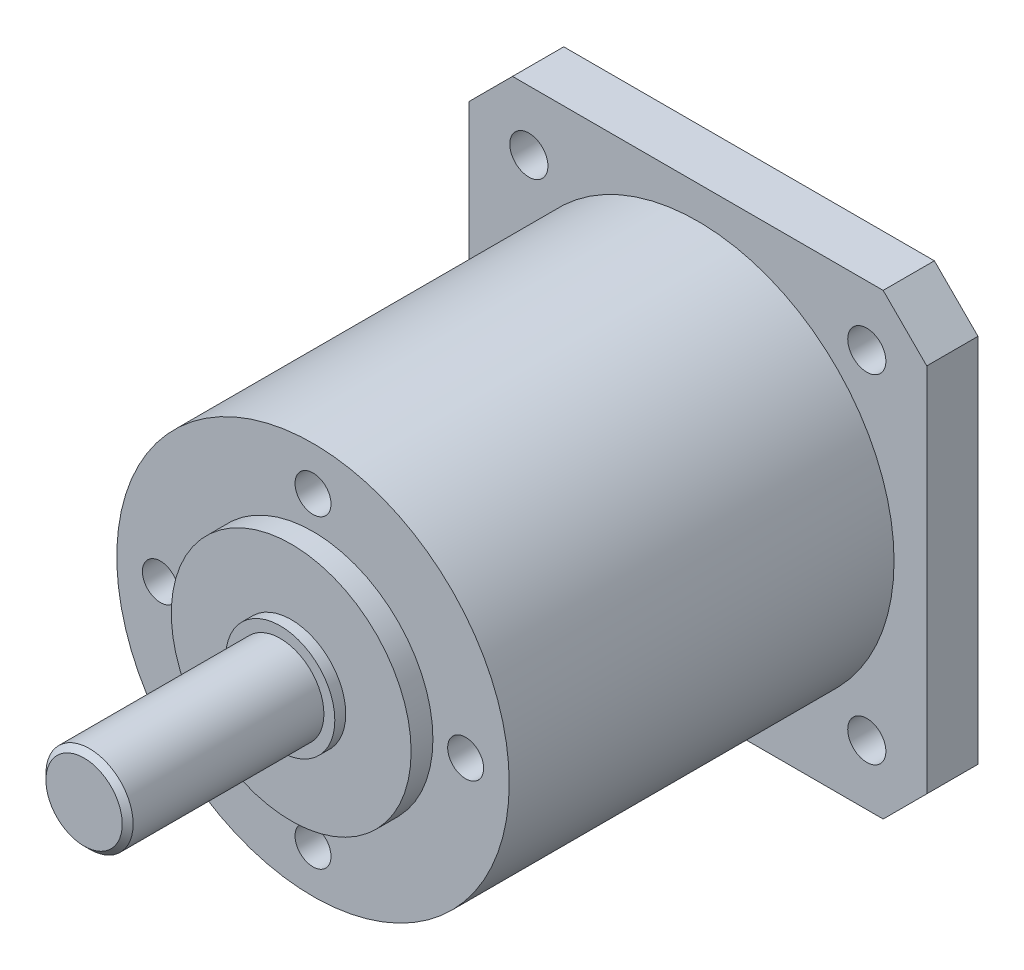
ISO-10303-21;
HEADER;
FILE_DESCRIPTION(('STEP AP214'),'2;1');
FILE_NAME('part.step','',(''),(''),'','','');
FILE_SCHEMA(('AUTOMOTIVE_DESIGN { 1 0 10303 214 1 1 1 1 }'));
ENDSEC;
DATA;
#1=APPLICATION_CONTEXT('core data for automotive mechanical design processes');
#2=APPLICATION_PROTOCOL_DEFINITION('international standard','automotive_design',2000,#1);
#3=PRODUCT_CONTEXT('',#1,'mechanical');
#4=PRODUCT('Part','Part','',(#3));
#5=PRODUCT_RELATED_PRODUCT_CATEGORY('part','',(#4));
#6=PRODUCT_DEFINITION_FORMATION('','',#4);
#7=PRODUCT_DEFINITION_CONTEXT('part definition',#1,'design');
#8=PRODUCT_DEFINITION('design','',#6,#7);
#9=PRODUCT_DEFINITION_SHAPE('','',#8);
#10=(LENGTH_UNIT() NAMED_UNIT(*) SI_UNIT(.MILLI.,.METRE.));
#11=(NAMED_UNIT(*) PLANE_ANGLE_UNIT() SI_UNIT($,.RADIAN.));
#12=(NAMED_UNIT(*) SI_UNIT($,.STERADIAN.) SOLID_ANGLE_UNIT());
#13=UNCERTAINTY_MEASURE_WITH_UNIT(LENGTH_MEASURE(1.E-05),#10,'distance_accuracy_value','');
#14=(GEOMETRIC_REPRESENTATION_CONTEXT(3) GLOBAL_UNCERTAINTY_ASSIGNED_CONTEXT((#13)) GLOBAL_UNIT_ASSIGNED_CONTEXT((#10,
#11,#12)) REPRESENTATION_CONTEXT('',''));
#15=CARTESIAN_POINT('',(0.,0.,0.));
#16=DIRECTION('',(0.,0.,1.));
#17=DIRECTION('',(1.,0.,0.));
#18=AXIS2_PLACEMENT_3D('',#15,#16,#17);
#19=CARTESIAN_POINT('',(-17.,21.,4.7));
#20=DIRECTION('',(0.,-1.,0.));
#21=DIRECTION('',(0.,0.,-1.));
#22=AXIS2_PLACEMENT_3D('',#19,#20,#21);
#23=PLANE('',#22);
#24=DIRECTION('',(-1.,0.,0.));
#25=VECTOR('',#24,1.);
#26=CARTESIAN_POINT('',(-17.,21.,0.));
#27=LINE('',#26,#25);
#28=CARTESIAN_POINT('',(17.,21.,0.));
#29=VERTEX_POINT('',#28);
#30=CARTESIAN_POINT('',(-17.,21.,0.));
#31=VERTEX_POINT('',#30);
#32=EDGE_CURVE('E143',#29,#31,#27,.T.);
#33=ORIENTED_EDGE('',*,*,#32,.T.);
#34=DIRECTION('',(0.,0.,-1.));
#35=VECTOR('',#34,1.);
#36=CARTESIAN_POINT('',(-17.,21.,4.7));
#37=LINE('',#36,#35);
#38=CARTESIAN_POINT('',(-17.,21.,4.7));
#39=VERTEX_POINT('',#38);
#40=EDGE_CURVE('E171',#39,#31,#37,.T.);
#41=ORIENTED_EDGE('',*,*,#40,.F.);
#42=DIRECTION('',(-1.,0.,0.));
#43=VECTOR('',#42,1.);
#44=CARTESIAN_POINT('',(-17.,21.,4.7));
#45=LINE('',#44,#43);
#46=CARTESIAN_POINT('',(17.,21.,4.7));
#47=VERTEX_POINT('',#46);
#48=EDGE_CURVE('E158',#47,#39,#45,.T.);
#49=ORIENTED_EDGE('',*,*,#48,.F.);
#50=DIRECTION('',(0.,0.,-1.));
#51=VECTOR('',#50,1.);
#52=CARTESIAN_POINT('',(17.,21.,4.7));
#53=LINE('',#52,#51);
#54=EDGE_CURVE('E139',#47,#29,#53,.T.);
#55=ORIENTED_EDGE('',*,*,#54,.T.);
#56=EDGE_LOOP('',(#33,#41,#49,#55));
#57=FACE_BOUND('',#56,.T.);
#58=ADVANCED_FACE('F41',(#57),#23,.F.);
#59=CARTESIAN_POINT('',(-21.,17.,4.7));
#60=DIRECTION('',(0.707106781186548,-0.707106781186548,0.));
#61=DIRECTION('',(0.707106781186548,0.707106781186548,0.));
#62=AXIS2_PLACEMENT_3D('',#59,#60,#61);
#63=PLANE('',#62);
#64=DIRECTION('',(-0.707106781186548,-0.707106781186548,0.));
#65=VECTOR('',#64,1.);
#66=CARTESIAN_POINT('',(-21.,17.,0.));
#67=LINE('',#66,#65);
#68=CARTESIAN_POINT('',(-21.,17.,0.));
#69=VERTEX_POINT('',#68);
#70=EDGE_CURVE('E146',#31,#69,#67,.T.);
#71=ORIENTED_EDGE('',*,*,#70,.T.);
#72=DIRECTION('',(0.,0.,-1.));
#73=VECTOR('',#72,1.);
#74=CARTESIAN_POINT('',(-21.,17.,4.7));
#75=LINE('',#74,#73);
#76=CARTESIAN_POINT('',(-21.,17.,4.7));
#77=VERTEX_POINT('',#76);
#78=EDGE_CURVE('E168',#77,#69,#75,.T.);
#79=ORIENTED_EDGE('',*,*,#78,.F.);
#80=DIRECTION('',(-0.707106781186548,-0.707106781186548,0.));
#81=VECTOR('',#80,1.);
#82=CARTESIAN_POINT('',(-21.,17.,4.7));
#83=LINE('',#82,#81);
#84=EDGE_CURVE('E104',#39,#77,#83,.T.);
#85=ORIENTED_EDGE('',*,*,#84,.F.);
#86=ORIENTED_EDGE('',*,*,#40,.T.);
#87=EDGE_LOOP('',(#71,#79,#85,#86));
#88=FACE_BOUND('',#87,.T.);
#89=ADVANCED_FACE('F281',(#88),#63,.F.);
#90=CARTESIAN_POINT('',(-21.,17.,4.7));
#91=DIRECTION('',(1.,0.,0.));
#92=DIRECTION('',(0.,0.,-1.));
#93=AXIS2_PLACEMENT_3D('',#90,#91,#92);
#94=PLANE('',#93);
#95=DIRECTION('',(0.,-1.,0.));
#96=VECTOR('',#95,1.);
#97=CARTESIAN_POINT('',(-21.,17.,0.));
#98=LINE('',#97,#96);
#99=CARTESIAN_POINT('',(-21.,-17.,0.));
#100=VERTEX_POINT('',#99);
#101=EDGE_CURVE('E149',#69,#100,#98,.T.);
#102=ORIENTED_EDGE('',*,*,#101,.T.);
#103=DIRECTION('',(0.,0.,-1.));
#104=VECTOR('',#103,1.);
#105=CARTESIAN_POINT('',(-21.,-17.,4.7));
#106=LINE('',#105,#104);
#107=CARTESIAN_POINT('',(-21.,-17.,4.7));
#108=VERTEX_POINT('',#107);
#109=EDGE_CURVE('E165',#108,#100,#106,.T.);
#110=ORIENTED_EDGE('',*,*,#109,.F.);
#111=DIRECTION('',(0.,-1.,0.));
#112=VECTOR('',#111,1.);
#113=CARTESIAN_POINT('',(-21.,17.,4.7));
#114=LINE('',#113,#112);
#115=EDGE_CURVE('E248',#77,#108,#114,.T.);
#116=ORIENTED_EDGE('',*,*,#115,.F.);
#117=ORIENTED_EDGE('',*,*,#78,.T.);
#118=EDGE_LOOP('',(#102,#110,#116,#117));
#119=FACE_BOUND('',#118,.T.);
#120=ADVANCED_FACE('F285',(#119),#94,.F.);
#121=CARTESIAN_POINT('',(-21.,-17.,4.7));
#122=DIRECTION('',(0.707106781186548,0.707106781186548,0.));
#123=DIRECTION('',(-0.707106781186548,0.707106781186548,0.));
#124=AXIS2_PLACEMENT_3D('',#121,#122,#123);
#125=PLANE('',#124);
#126=DIRECTION('',(0.707106781186548,-0.707106781186548,0.));
#127=VECTOR('',#126,1.);
#128=CARTESIAN_POINT('',(-21.,-17.,0.));
#129=LINE('',#128,#127);
#130=CARTESIAN_POINT('',(-17.,-21.,0.));
#131=VERTEX_POINT('',#130);
#132=EDGE_CURVE('E151',#100,#131,#129,.T.);
#133=ORIENTED_EDGE('',*,*,#132,.T.);
#134=DIRECTION('',(0.,0.,-1.));
#135=VECTOR('',#134,1.);
#136=CARTESIAN_POINT('',(-17.,-21.,4.7));
#137=LINE('',#136,#135);
#138=CARTESIAN_POINT('',(-17.,-21.,4.7));
#139=VERTEX_POINT('',#138);
#140=EDGE_CURVE('E162',#139,#131,#137,.T.);
#141=ORIENTED_EDGE('',*,*,#140,.F.);
#142=DIRECTION('',(0.707106781186548,-0.707106781186548,0.));
#143=VECTOR('',#142,1.);
#144=CARTESIAN_POINT('',(-21.,-17.,4.7));
#145=LINE('',#144,#143);
#146=EDGE_CURVE('E250',#108,#139,#145,.T.);
#147=ORIENTED_EDGE('',*,*,#146,.F.);
#148=ORIENTED_EDGE('',*,*,#109,.T.);
#149=EDGE_LOOP('',(#133,#141,#147,#148));
#150=FACE_BOUND('',#149,.T.);
#151=ADVANCED_FACE('F256',(#150),#125,.F.);
#152=CARTESIAN_POINT('',(-17.,-21.,4.7));
#153=DIRECTION('',(0.,1.,0.));
#154=DIRECTION('',(0.,0.,1.));
#155=AXIS2_PLACEMENT_3D('',#152,#153,#154);
#156=PLANE('',#155);
#157=DIRECTION('',(1.,0.,0.));
#158=VECTOR('',#157,1.);
#159=CARTESIAN_POINT('',(-17.,-21.,0.));
#160=LINE('',#159,#158);
#161=CARTESIAN_POINT('',(17.,-21.,0.));
#162=VERTEX_POINT('',#161);
#163=EDGE_CURVE('E153',#131,#162,#160,.T.);
#164=ORIENTED_EDGE('',*,*,#163,.T.);
#165=DIRECTION('',(0.,0.,-1.));
#166=VECTOR('',#165,1.);
#167=CARTESIAN_POINT('',(17.,-21.,4.7));
#168=LINE('',#167,#166);
#169=CARTESIAN_POINT('',(17.,-21.,4.7));
#170=VERTEX_POINT('',#169);
#171=EDGE_CURVE('E134',#170,#162,#168,.T.);
#172=ORIENTED_EDGE('',*,*,#171,.F.);
#173=DIRECTION('',(1.,0.,0.));
#174=VECTOR('',#173,1.);
#175=CARTESIAN_POINT('',(-17.,-21.,4.7));
#176=LINE('',#175,#174);
#177=EDGE_CURVE('E125',#139,#170,#176,.T.);
#178=ORIENTED_EDGE('',*,*,#177,.F.);
#179=ORIENTED_EDGE('',*,*,#140,.T.);
#180=EDGE_LOOP('',(#164,#172,#178,#179));
#181=FACE_BOUND('',#180,.T.);
#182=ADVANCED_FACE('F260',(#181),#156,.F.);
#183=CARTESIAN_POINT('',(17.,-21.,4.7));
#184=DIRECTION('',(-0.707106781186548,0.707106781186548,0.));
#185=DIRECTION('',(-0.707106781186548,-0.707106781186548,0.));
#186=AXIS2_PLACEMENT_3D('',#183,#184,#185);
#187=PLANE('',#186);
#188=DIRECTION('',(0.707106781186548,0.707106781186548,0.));
#189=VECTOR('',#188,1.);
#190=CARTESIAN_POINT('',(17.,-21.,0.));
#191=LINE('',#190,#189);
#192=CARTESIAN_POINT('',(21.,-17.,0.));
#193=VERTEX_POINT('',#192);
#194=EDGE_CURVE('E133',#162,#193,#191,.T.);
#195=ORIENTED_EDGE('',*,*,#194,.T.);
#196=DIRECTION('',(0.,0.,-1.));
#197=VECTOR('',#196,1.);
#198=CARTESIAN_POINT('',(21.,-17.,4.7));
#199=LINE('',#198,#197);
#200=CARTESIAN_POINT('',(21.,-17.,4.7));
#201=VERTEX_POINT('',#200);
#202=EDGE_CURVE('E130',#201,#193,#199,.T.);
#203=ORIENTED_EDGE('',*,*,#202,.F.);
#204=DIRECTION('',(0.707106781186548,0.707106781186548,0.));
#205=VECTOR('',#204,1.);
#206=CARTESIAN_POINT('',(17.,-21.,4.7));
#207=LINE('',#206,#205);
#208=EDGE_CURVE('E119',#170,#201,#207,.T.);
#209=ORIENTED_EDGE('',*,*,#208,.F.);
#210=ORIENTED_EDGE('',*,*,#171,.T.);
#211=EDGE_LOOP('',(#195,#203,#209,#210));
#212=FACE_BOUND('',#211,.T.);
#213=ADVANCED_FACE('F131',(#212),#187,.F.);
#214=CARTESIAN_POINT('',(21.,17.,4.7));
#215=DIRECTION('',(-1.,0.,0.));
#216=DIRECTION('',(0.,0.,1.));
#217=AXIS2_PLACEMENT_3D('',#214,#215,#216);
#218=PLANE('',#217);
#219=DIRECTION('',(0.,1.,0.));
#220=VECTOR('',#219,1.);
#221=CARTESIAN_POINT('',(21.,17.,0.));
#222=LINE('',#221,#220);
#223=CARTESIAN_POINT('',(21.,17.,0.));
#224=VERTEX_POINT('',#223);
#225=EDGE_CURVE('E89',#193,#224,#222,.T.);
#226=ORIENTED_EDGE('',*,*,#225,.T.);
#227=DIRECTION('',(0.,0.,-1.));
#228=VECTOR('',#227,1.);
#229=CARTESIAN_POINT('',(21.,17.,4.7));
#230=LINE('',#229,#228);
#231=CARTESIAN_POINT('',(21.,17.,4.7));
#232=VERTEX_POINT('',#231);
#233=EDGE_CURVE('E135',#232,#224,#230,.T.);
#234=ORIENTED_EDGE('',*,*,#233,.F.);
#235=DIRECTION('',(0.,1.,0.));
#236=VECTOR('',#235,1.);
#237=CARTESIAN_POINT('',(21.,17.,4.7));
#238=LINE('',#237,#236);
#239=EDGE_CURVE('E123',#201,#232,#238,.T.);
#240=ORIENTED_EDGE('',*,*,#239,.F.);
#241=ORIENTED_EDGE('',*,*,#202,.T.);
#242=EDGE_LOOP('',(#226,#234,#240,#241));
#243=FACE_BOUND('',#242,.T.);
#244=ADVANCED_FACE('F137',(#243),#218,.F.);
#245=CARTESIAN_POINT('',(17.,21.,4.7));
#246=DIRECTION('',(-0.707106781186548,-0.707106781186548,0.));
#247=DIRECTION('',(0.707106781186548,-0.707106781186548,0.));
#248=AXIS2_PLACEMENT_3D('',#245,#246,#247);
#249=PLANE('',#248);
#250=DIRECTION('',(-0.707106781186548,0.707106781186548,0.));
#251=VECTOR('',#250,1.);
#252=CARTESIAN_POINT('',(17.,21.,0.));
#253=LINE('',#252,#251);
#254=EDGE_CURVE('E95',#224,#29,#253,.T.);
#255=ORIENTED_EDGE('',*,*,#254,.T.);
#256=ORIENTED_EDGE('',*,*,#54,.F.);
#257=DIRECTION('',(-0.707106781186548,0.707106781186548,0.));
#258=VECTOR('',#257,1.);
#259=CARTESIAN_POINT('',(17.,21.,4.7));
#260=LINE('',#259,#258);
#261=EDGE_CURVE('E59',#232,#47,#260,.T.);
#262=ORIENTED_EDGE('',*,*,#261,.F.);
#263=ORIENTED_EDGE('',*,*,#233,.T.);
#264=EDGE_LOOP('',(#255,#256,#262,#263));
#265=FACE_BOUND('',#264,.T.);
#266=ADVANCED_FACE('F268',(#265),#249,.F.);
#267=CARTESIAN_POINT('',(0.,0.,4.7));
#268=DIRECTION('',(0.,0.,-1.));
#269=DIRECTION('',(-1.,0.,0.));
#270=AXIS2_PLACEMENT_3D('',#267,#268,#269);
#271=PLANE('',#270);
#272=CARTESIAN_POINT('',(-15.5,-15.5,4.7));
#273=DIRECTION('',(0.,0.,-1.));
#274=DIRECTION('',(-1.,0.,0.));
#275=AXIS2_PLACEMENT_3D('',#272,#273,#274);
#276=CIRCLE('',#275,1.74999999999999);
#277=CARTESIAN_POINT('',(-17.25,-15.5,4.7));
#278=VERTEX_POINT('',#277);
#279=EDGE_CURVE('E221',#278,#278,#276,.T.);
#280=ORIENTED_EDGE('',*,*,#279,.T.);
#281=EDGE_LOOP('',(#280));
#282=FACE_BOUND('',#281,.T.);
#283=CARTESIAN_POINT('',(15.5,15.5,4.7));
#284=DIRECTION('',(0.,0.,-1.));
#285=DIRECTION('',(-1.,0.,0.));
#286=AXIS2_PLACEMENT_3D('',#283,#284,#285);
#287=CIRCLE('',#286,1.74999999999999);
#288=CARTESIAN_POINT('',(13.75,15.5,4.7));
#289=VERTEX_POINT('',#288);
#290=EDGE_CURVE('E227',#289,#289,#287,.T.);
#291=ORIENTED_EDGE('',*,*,#290,.T.);
#292=EDGE_LOOP('',(#291));
#293=FACE_BOUND('',#292,.T.);
#294=CARTESIAN_POINT('',(15.5,-15.5,4.7));
#295=DIRECTION('',(0.,0.,-1.));
#296=DIRECTION('',(-1.,0.,0.));
#297=AXIS2_PLACEMENT_3D('',#294,#295,#296);
#298=CIRCLE('',#297,1.74999999999999);
#299=CARTESIAN_POINT('',(13.75,-15.5,4.7));
#300=VERTEX_POINT('',#299);
#301=EDGE_CURVE('E233',#300,#300,#298,.T.);
#302=ORIENTED_EDGE('',*,*,#301,.T.);
#303=EDGE_LOOP('',(#302));
#304=FACE_BOUND('',#303,.T.);
#305=CARTESIAN_POINT('',(-15.5,15.5,4.7));
#306=DIRECTION('',(0.,0.,-1.));
#307=DIRECTION('',(-1.,0.,0.));
#308=AXIS2_PLACEMENT_3D('',#305,#306,#307);
#309=CIRCLE('',#308,1.74999999999999);
#310=CARTESIAN_POINT('',(-17.25,15.5,4.7));
#311=VERTEX_POINT('',#310);
#312=EDGE_CURVE('E239',#311,#311,#309,.T.);
#313=ORIENTED_EDGE('',*,*,#312,.T.);
#314=EDGE_LOOP('',(#313));
#315=FACE_BOUND('',#314,.T.);
#316=CARTESIAN_POINT('',(0.,0.,4.7));
#317=DIRECTION('',(0.,0.,1.));
#318=DIRECTION('',(1.,0.,0.));
#319=AXIS2_PLACEMENT_3D('',#316,#317,#318);
#320=CIRCLE('',#319,18.);
#321=CARTESIAN_POINT('',(18.,0.,4.7));
#322=VERTEX_POINT('',#321);
#323=EDGE_CURVE('E172',#322,#322,#320,.T.);
#324=ORIENTED_EDGE('',*,*,#323,.F.);
#325=EDGE_LOOP('',(#324));
#326=FACE_BOUND('',#325,.T.);
#327=ORIENTED_EDGE('',*,*,#48,.T.);
#328=ORIENTED_EDGE('',*,*,#84,.T.);
#329=ORIENTED_EDGE('',*,*,#115,.T.);
#330=ORIENTED_EDGE('',*,*,#146,.T.);
#331=ORIENTED_EDGE('',*,*,#177,.T.);
#332=ORIENTED_EDGE('',*,*,#208,.T.);
#333=ORIENTED_EDGE('',*,*,#239,.T.);
#334=ORIENTED_EDGE('',*,*,#261,.T.);
#335=EDGE_LOOP('',(#327,#328,#329,#330,#331,#332,#333,#334));
#336=FACE_BOUND('',#335,.T.);
#337=ADVANCED_FACE('F121',(#282,#293,#304,#315,#326,#336),#271,.F.);
#338=CARTESIAN_POINT('',(0.,0.,0.));
#339=DIRECTION('',(0.,0.,-1.));
#340=DIRECTION('',(-1.,0.,0.));
#341=AXIS2_PLACEMENT_3D('',#338,#339,#340);
#342=PLANE('',#341);
#343=CARTESIAN_POINT('',(-15.5,-15.5,0.));
#344=DIRECTION('',(0.,0.,-1.));
#345=DIRECTION('',(-1.,0.,0.));
#346=AXIS2_PLACEMENT_3D('',#343,#344,#345);
#347=CIRCLE('',#346,1.74999999999999);
#348=CARTESIAN_POINT('',(-17.25,-15.5,0.));
#349=VERTEX_POINT('',#348);
#350=EDGE_CURVE('E218',#349,#349,#347,.T.);
#351=ORIENTED_EDGE('',*,*,#350,.F.);
#352=EDGE_LOOP('',(#351));
#353=FACE_BOUND('',#352,.T.);
#354=CARTESIAN_POINT('',(15.5,15.5,0.));
#355=DIRECTION('',(0.,0.,-1.));
#356=DIRECTION('',(-1.,0.,0.));
#357=AXIS2_PLACEMENT_3D('',#354,#355,#356);
#358=CIRCLE('',#357,1.74999999999999);
#359=CARTESIAN_POINT('',(13.75,15.5,0.));
#360=VERTEX_POINT('',#359);
#361=EDGE_CURVE('E224',#360,#360,#358,.T.);
#362=ORIENTED_EDGE('',*,*,#361,.F.);
#363=EDGE_LOOP('',(#362));
#364=FACE_BOUND('',#363,.T.);
#365=CARTESIAN_POINT('',(15.5,-15.5,0.));
#366=DIRECTION('',(0.,0.,-1.));
#367=DIRECTION('',(-1.,0.,0.));
#368=AXIS2_PLACEMENT_3D('',#365,#366,#367);
#369=CIRCLE('',#368,1.74999999999999);
#370=CARTESIAN_POINT('',(13.75,-15.5,0.));
#371=VERTEX_POINT('',#370);
#372=EDGE_CURVE('E230',#371,#371,#369,.T.);
#373=ORIENTED_EDGE('',*,*,#372,.F.);
#374=EDGE_LOOP('',(#373));
#375=FACE_BOUND('',#374,.T.);
#376=CARTESIAN_POINT('',(-15.5,15.5,0.));
#377=DIRECTION('',(0.,0.,-1.));
#378=DIRECTION('',(-1.,0.,0.));
#379=AXIS2_PLACEMENT_3D('',#376,#377,#378);
#380=CIRCLE('',#379,1.74999999999999);
#381=CARTESIAN_POINT('',(-17.25,15.5,0.));
#382=VERTEX_POINT('',#381);
#383=EDGE_CURVE('E236',#382,#382,#380,.T.);
#384=ORIENTED_EDGE('',*,*,#383,.F.);
#385=EDGE_LOOP('',(#384));
#386=FACE_BOUND('',#385,.T.);
#387=ORIENTED_EDGE('',*,*,#32,.F.);
#388=ORIENTED_EDGE('',*,*,#254,.F.);
#389=ORIENTED_EDGE('',*,*,#225,.F.);
#390=ORIENTED_EDGE('',*,*,#194,.F.);
#391=ORIENTED_EDGE('',*,*,#163,.F.);
#392=ORIENTED_EDGE('',*,*,#132,.F.);
#393=ORIENTED_EDGE('',*,*,#101,.F.);
#394=ORIENTED_EDGE('',*,*,#70,.F.);
#395=EDGE_LOOP('',(#387,#388,#389,#390,#391,#392,#393,#394));
#396=FACE_BOUND('',#395,.T.);
#397=ADVANCED_FACE('F263',(#353,#364,#375,#386,#396),#342,.T.);
#398=CARTESIAN_POINT('',(0.,0.,40.));
#399=DIRECTION('',(0.,0.,-1.));
#400=DIRECTION('',(-1.,0.,0.));
#401=AXIS2_PLACEMENT_3D('',#398,#399,#400);
#402=CYLINDRICAL_SURFACE('',#401,18.);
#403=CARTESIAN_POINT('',(0.,0.,40.));
#404=DIRECTION('',(0.,0.,1.));
#405=DIRECTION('',(1.,0.,0.));
#406=AXIS2_PLACEMENT_3D('',#403,#404,#405);
#407=CIRCLE('',#406,18.);
#408=CARTESIAN_POINT('',(18.,0.,40.));
#409=VERTEX_POINT('',#408);
#410=EDGE_CURVE('E147',#409,#409,#407,.T.);
#411=ORIENTED_EDGE('',*,*,#410,.F.);
#412=EDGE_LOOP('',(#411));
#413=FACE_BOUND('',#412,.T.);
#414=ORIENTED_EDGE('',*,*,#323,.T.);
#415=EDGE_LOOP('',(#414));
#416=FACE_BOUND('',#415,.T.);
#417=ADVANCED_FACE('F325',(#413,#416),#402,.T.);
#418=CARTESIAN_POINT('',(0.,0.,40.));
#419=DIRECTION('',(0.,0.,1.));
#420=DIRECTION('',(1.,0.,0.));
#421=AXIS2_PLACEMENT_3D('',#418,#419,#420);
#422=PLANE('',#421);
#423=CARTESIAN_POINT('',(0.,0.,40.));
#424=DIRECTION('',(0.,0.,1.));
#425=DIRECTION('',(1.,0.,0.));
#426=AXIS2_PLACEMENT_3D('',#423,#424,#425);
#427=CIRCLE('',#426,11.);
#428=CARTESIAN_POINT('',(11.,0.,40.));
#429=VERTEX_POINT('',#428);
#430=EDGE_CURVE('E187',#429,#429,#427,.T.);
#431=ORIENTED_EDGE('',*,*,#430,.F.);
#432=EDGE_LOOP('',(#431));
#433=FACE_BOUND('',#432,.T.);
#434=CARTESIAN_POINT('',(0.,14.,40.));
#435=DIRECTION('',(0.,0.,1.));
#436=DIRECTION('',(1.,0.,0.));
#437=AXIS2_PLACEMENT_3D('',#434,#435,#436);
#438=CIRCLE('',#437,1.65);
#439=CARTESIAN_POINT('',(1.65,14.,40.));
#440=VERTEX_POINT('',#439);
#441=EDGE_CURVE('E192',#440,#440,#438,.T.);
#442=ORIENTED_EDGE('',*,*,#441,.F.);
#443=EDGE_LOOP('',(#442));
#444=FACE_BOUND('',#443,.T.);
#445=CARTESIAN_POINT('',(0.,-14.,40.));
#446=DIRECTION('',(0.,0.,1.));
#447=DIRECTION('',(1.,0.,0.));
#448=AXIS2_PLACEMENT_3D('',#445,#446,#447);
#449=CIRCLE('',#448,1.65);
#450=CARTESIAN_POINT('',(1.65,-14.,40.));
#451=VERTEX_POINT('',#450);
#452=EDGE_CURVE('E200',#451,#451,#449,.T.);
#453=ORIENTED_EDGE('',*,*,#452,.F.);
#454=EDGE_LOOP('',(#453));
#455=FACE_BOUND('',#454,.T.);
#456=CARTESIAN_POINT('',(-14.,0.,40.));
#457=DIRECTION('',(0.,0.,1.));
#458=DIRECTION('',(1.,0.,0.));
#459=AXIS2_PLACEMENT_3D('',#456,#457,#458);
#460=CIRCLE('',#459,1.65);
#461=CARTESIAN_POINT('',(-12.35,0.,40.));
#462=VERTEX_POINT('',#461);
#463=EDGE_CURVE('E206',#462,#462,#460,.T.);
#464=ORIENTED_EDGE('',*,*,#463,.F.);
#465=EDGE_LOOP('',(#464));
#466=FACE_BOUND('',#465,.T.);
#467=CARTESIAN_POINT('',(14.,0.,40.));
#468=DIRECTION('',(0.,0.,1.));
#469=DIRECTION('',(1.,0.,0.));
#470=AXIS2_PLACEMENT_3D('',#467,#468,#469);
#471=CIRCLE('',#470,1.65);
#472=CARTESIAN_POINT('',(15.65,0.,40.));
#473=VERTEX_POINT('',#472);
#474=EDGE_CURVE('E212',#473,#473,#471,.T.);
#475=ORIENTED_EDGE('',*,*,#474,.F.);
#476=EDGE_LOOP('',(#475));
#477=FACE_BOUND('',#476,.T.);
#478=ORIENTED_EDGE('',*,*,#410,.T.);
#479=EDGE_LOOP('',(#478));
#480=FACE_BOUND('',#479,.T.);
#481=ADVANCED_FACE('F334',(#433,#444,#455,#466,#477,#480),#422,.T.);
#482=CARTESIAN_POINT('',(-15.5,15.5,0.));
#483=DIRECTION('',(0.,0.,-1.));
#484=DIRECTION('',(-1.,0.,0.));
#485=AXIS2_PLACEMENT_3D('',#482,#483,#484);
#486=CYLINDRICAL_SURFACE('',#485,1.74999999999999);
#487=ORIENTED_EDGE('',*,*,#383,.T.);
#488=EDGE_LOOP('',(#487));
#489=FACE_BOUND('',#488,.T.);
#490=ORIENTED_EDGE('',*,*,#312,.F.);
#491=EDGE_LOOP('',(#490));
#492=FACE_BOUND('',#491,.T.);
#493=ADVANCED_FACE('F344',(#489,#492),#486,.F.);
#494=CARTESIAN_POINT('',(15.5,-15.5,0.));
#495=DIRECTION('',(0.,0.,-1.));
#496=DIRECTION('',(-1.,0.,0.));
#497=AXIS2_PLACEMENT_3D('',#494,#495,#496);
#498=CYLINDRICAL_SURFACE('',#497,1.74999999999999);
#499=ORIENTED_EDGE('',*,*,#372,.T.);
#500=EDGE_LOOP('',(#499));
#501=FACE_BOUND('',#500,.T.);
#502=ORIENTED_EDGE('',*,*,#301,.F.);
#503=EDGE_LOOP('',(#502));
#504=FACE_BOUND('',#503,.T.);
#505=ADVANCED_FACE('F355',(#501,#504),#498,.F.);
#506=CARTESIAN_POINT('',(15.5,15.5,0.));
#507=DIRECTION('',(0.,0.,-1.));
#508=DIRECTION('',(-1.,0.,0.));
#509=AXIS2_PLACEMENT_3D('',#506,#507,#508);
#510=CYLINDRICAL_SURFACE('',#509,1.74999999999999);
#511=ORIENTED_EDGE('',*,*,#361,.T.);
#512=EDGE_LOOP('',(#511));
#513=FACE_BOUND('',#512,.T.);
#514=ORIENTED_EDGE('',*,*,#290,.F.);
#515=EDGE_LOOP('',(#514));
#516=FACE_BOUND('',#515,.T.);
#517=ADVANCED_FACE('F365',(#513,#516),#510,.F.);
#518=CARTESIAN_POINT('',(-15.5,-15.5,0.));
#519=DIRECTION('',(0.,0.,-1.));
#520=DIRECTION('',(-1.,0.,0.));
#521=AXIS2_PLACEMENT_3D('',#518,#519,#520);
#522=CYLINDRICAL_SURFACE('',#521,1.74999999999999);
#523=ORIENTED_EDGE('',*,*,#350,.T.);
#524=EDGE_LOOP('',(#523));
#525=FACE_BOUND('',#524,.T.);
#526=ORIENTED_EDGE('',*,*,#279,.F.);
#527=EDGE_LOOP('',(#526));
#528=FACE_BOUND('',#527,.T.);
#529=ADVANCED_FACE('F375',(#525,#528),#522,.F.);
#530=CARTESIAN_POINT('',(14.,0.,32.));
#531=DIRECTION('',(0.,0.,1.));
#532=DIRECTION('',(1.,0.,0.));
#533=AXIS2_PLACEMENT_3D('',#530,#531,#532);
#534=CONICAL_SURFACE('',#533,1.65,1.02974425867665);
#535=CARTESIAN_POINT('',(14.,0.,31.0085799786045));
#536=VERTEX_POINT('',#535);
#537=VERTEX_LOOP('',#536);
#538=FACE_BOUND('',#537,.T.);
#539=CARTESIAN_POINT('',(14.,0.,32.));
#540=DIRECTION('',(0.,0.,1.));
#541=DIRECTION('',(1.,0.,0.));
#542=AXIS2_PLACEMENT_3D('',#539,#540,#541);
#543=CIRCLE('',#542,1.65);
#544=CARTESIAN_POINT('',(15.65,0.,32.));
#545=VERTEX_POINT('',#544);
#546=EDGE_CURVE('E215',#545,#545,#543,.T.);
#547=ORIENTED_EDGE('',*,*,#546,.T.);
#548=EDGE_LOOP('',(#547));
#549=FACE_BOUND('',#548,.T.);
#550=ADVANCED_FACE('F385',(#538,#549),#534,.F.);
#551=CARTESIAN_POINT('',(14.,0.,40.));
#552=DIRECTION('',(0.,0.,1.));
#553=DIRECTION('',(1.,0.,0.));
#554=AXIS2_PLACEMENT_3D('',#551,#552,#553);
#555=CYLINDRICAL_SURFACE('',#554,1.65);
#556=ORIENTED_EDGE('',*,*,#546,.F.);
#557=EDGE_LOOP('',(#556));
#558=FACE_BOUND('',#557,.T.);
#559=ORIENTED_EDGE('',*,*,#474,.T.);
#560=EDGE_LOOP('',(#559));
#561=FACE_BOUND('',#560,.T.);
#562=ADVANCED_FACE('F395',(#558,#561),#555,.F.);
#563=CARTESIAN_POINT('',(-14.,0.,32.));
#564=DIRECTION('',(0.,0.,1.));
#565=DIRECTION('',(1.,0.,0.));
#566=AXIS2_PLACEMENT_3D('',#563,#564,#565);
#567=CONICAL_SURFACE('',#566,1.65,1.02974425867665);
#568=CARTESIAN_POINT('',(-14.,0.,31.0085799786045));
#569=VERTEX_POINT('',#568);
#570=VERTEX_LOOP('',#569);
#571=FACE_BOUND('',#570,.T.);
#572=CARTESIAN_POINT('',(-14.,0.,32.));
#573=DIRECTION('',(0.,0.,1.));
#574=DIRECTION('',(1.,0.,0.));
#575=AXIS2_PLACEMENT_3D('',#572,#573,#574);
#576=CIRCLE('',#575,1.65);
#577=CARTESIAN_POINT('',(-12.35,0.,32.));
#578=VERTEX_POINT('',#577);
#579=EDGE_CURVE('E209',#578,#578,#576,.T.);
#580=ORIENTED_EDGE('',*,*,#579,.T.);
#581=EDGE_LOOP('',(#580));
#582=FACE_BOUND('',#581,.T.);
#583=ADVANCED_FACE('F405',(#571,#582),#567,.F.);
#584=CARTESIAN_POINT('',(-14.,0.,40.));
#585=DIRECTION('',(0.,0.,1.));
#586=DIRECTION('',(1.,0.,0.));
#587=AXIS2_PLACEMENT_3D('',#584,#585,#586);
#588=CYLINDRICAL_SURFACE('',#587,1.65);
#589=ORIENTED_EDGE('',*,*,#579,.F.);
#590=EDGE_LOOP('',(#589));
#591=FACE_BOUND('',#590,.T.);
#592=ORIENTED_EDGE('',*,*,#463,.T.);
#593=EDGE_LOOP('',(#592));
#594=FACE_BOUND('',#593,.T.);
#595=ADVANCED_FACE('F415',(#591,#594),#588,.F.);
#596=CARTESIAN_POINT('',(0.,-14.,32.));
#597=DIRECTION('',(0.,0.,1.));
#598=DIRECTION('',(1.,0.,0.));
#599=AXIS2_PLACEMENT_3D('',#596,#597,#598);
#600=CONICAL_SURFACE('',#599,1.65,1.02974425867665);
#601=CARTESIAN_POINT('',(0.,-14.,31.0085799786045));
#602=VERTEX_POINT('',#601);
#603=VERTEX_LOOP('',#602);
#604=FACE_BOUND('',#603,.T.);
#605=CARTESIAN_POINT('',(0.,-14.,32.));
#606=DIRECTION('',(0.,0.,1.));
#607=DIRECTION('',(1.,0.,0.));
#608=AXIS2_PLACEMENT_3D('',#605,#606,#607);
#609=CIRCLE('',#608,1.65);
#610=CARTESIAN_POINT('',(1.65,-14.,32.));
#611=VERTEX_POINT('',#610);
#612=EDGE_CURVE('E203',#611,#611,#609,.T.);
#613=ORIENTED_EDGE('',*,*,#612,.T.);
#614=EDGE_LOOP('',(#613));
#615=FACE_BOUND('',#614,.T.);
#616=ADVANCED_FACE('F425',(#604,#615),#600,.F.);
#617=CARTESIAN_POINT('',(0.,-14.,40.));
#618=DIRECTION('',(0.,0.,1.));
#619=DIRECTION('',(1.,0.,0.));
#620=AXIS2_PLACEMENT_3D('',#617,#618,#619);
#621=CYLINDRICAL_SURFACE('',#620,1.65);
#622=ORIENTED_EDGE('',*,*,#612,.F.);
#623=EDGE_LOOP('',(#622));
#624=FACE_BOUND('',#623,.T.);
#625=ORIENTED_EDGE('',*,*,#452,.T.);
#626=EDGE_LOOP('',(#625));
#627=FACE_BOUND('',#626,.T.);
#628=ADVANCED_FACE('F435',(#624,#627),#621,.F.);
#629=CARTESIAN_POINT('',(0.,14.,32.));
#630=DIRECTION('',(0.,0.,1.));
#631=DIRECTION('',(1.,0.,0.));
#632=AXIS2_PLACEMENT_3D('',#629,#630,#631);
#633=CONICAL_SURFACE('',#632,1.65,1.02974425867665);
#634=CARTESIAN_POINT('',(0.,14.,31.0085799786045));
#635=VERTEX_POINT('',#634);
#636=VERTEX_LOOP('',#635);
#637=FACE_BOUND('',#636,.T.);
#638=CARTESIAN_POINT('',(0.,14.,32.));
#639=DIRECTION('',(0.,0.,1.));
#640=DIRECTION('',(1.,0.,0.));
#641=AXIS2_PLACEMENT_3D('',#638,#639,#640);
#642=CIRCLE('',#641,1.65);
#643=CARTESIAN_POINT('',(1.65,14.,32.));
#644=VERTEX_POINT('',#643);
#645=EDGE_CURVE('E197',#644,#644,#642,.T.);
#646=ORIENTED_EDGE('',*,*,#645,.T.);
#647=EDGE_LOOP('',(#646));
#648=FACE_BOUND('',#647,.T.);
#649=ADVANCED_FACE('F445',(#637,#648),#633,.F.);
#650=CARTESIAN_POINT('',(0.,14.,40.));
#651=DIRECTION('',(0.,0.,1.));
#652=DIRECTION('',(1.,0.,0.));
#653=AXIS2_PLACEMENT_3D('',#650,#651,#652);
#654=CYLINDRICAL_SURFACE('',#653,1.65);
#655=ORIENTED_EDGE('',*,*,#645,.F.);
#656=EDGE_LOOP('',(#655));
#657=FACE_BOUND('',#656,.T.);
#658=ORIENTED_EDGE('',*,*,#441,.T.);
#659=EDGE_LOOP('',(#658));
#660=FACE_BOUND('',#659,.T.);
#661=ADVANCED_FACE('F455',(#657,#660),#654,.F.);
#662=CARTESIAN_POINT('',(0.,0.,42.));
#663=DIRECTION('',(0.,0.,-1.));
#664=DIRECTION('',(-1.,0.,0.));
#665=AXIS2_PLACEMENT_3D('',#662,#663,#664);
#666=CYLINDRICAL_SURFACE('',#665,11.);
#667=CARTESIAN_POINT('',(0.,0.,42.));
#668=DIRECTION('',(0.,0.,1.));
#669=DIRECTION('',(1.,0.,0.));
#670=AXIS2_PLACEMENT_3D('',#667,#668,#669);
#671=CIRCLE('',#670,11.);
#672=CARTESIAN_POINT('',(11.,0.,42.));
#673=VERTEX_POINT('',#672);
#674=EDGE_CURVE('E189',#673,#673,#671,.T.);
#675=ORIENTED_EDGE('',*,*,#674,.F.);
#676=EDGE_LOOP('',(#675));
#677=FACE_BOUND('',#676,.T.);
#678=ORIENTED_EDGE('',*,*,#430,.T.);
#679=EDGE_LOOP('',(#678));
#680=FACE_BOUND('',#679,.T.);
#681=ADVANCED_FACE('F464',(#677,#680),#666,.T.);
#682=CARTESIAN_POINT('',(0.,0.,42.));
#683=DIRECTION('',(0.,0.,1.));
#684=DIRECTION('',(1.,0.,0.));
#685=AXIS2_PLACEMENT_3D('',#682,#683,#684);
#686=PLANE('',#685);
#687=CARTESIAN_POINT('',(0.,0.,42.));
#688=DIRECTION('',(0.,0.,1.));
#689=DIRECTION('',(1.,0.,0.));
#690=AXIS2_PLACEMENT_3D('',#687,#688,#689);
#691=CIRCLE('',#690,5.);
#692=CARTESIAN_POINT('',(5.,0.,42.));
#693=VERTEX_POINT('',#692);
#694=EDGE_CURVE('E178',#693,#693,#691,.T.);
#695=ORIENTED_EDGE('',*,*,#694,.F.);
#696=EDGE_LOOP('',(#695));
#697=FACE_BOUND('',#696,.T.);
#698=ORIENTED_EDGE('',*,*,#674,.T.);
#699=EDGE_LOOP('',(#698));
#700=FACE_BOUND('',#699,.T.);
#701=ADVANCED_FACE('F473',(#697,#700),#686,.T.);
#702=CARTESIAN_POINT('',(0.,0.,43.));
#703=DIRECTION('',(0.,0.,-1.));
#704=DIRECTION('',(-1.,0.,0.));
#705=AXIS2_PLACEMENT_3D('',#702,#703,#704);
#706=CYLINDRICAL_SURFACE('',#705,5.);
#707=CARTESIAN_POINT('',(0.,0.,43.));
#708=DIRECTION('',(0.,0.,1.));
#709=DIRECTION('',(1.,0.,0.));
#710=AXIS2_PLACEMENT_3D('',#707,#708,#709);
#711=CIRCLE('',#710,5.);
#712=CARTESIAN_POINT('',(5.,0.,43.));
#713=VERTEX_POINT('',#712);
#714=EDGE_CURVE('E185',#713,#713,#711,.T.);
#715=ORIENTED_EDGE('',*,*,#714,.F.);
#716=EDGE_LOOP('',(#715));
#717=FACE_BOUND('',#716,.T.);
#718=ORIENTED_EDGE('',*,*,#694,.T.);
#719=EDGE_LOOP('',(#718));
#720=FACE_BOUND('',#719,.T.);
#721=ADVANCED_FACE('F483',(#717,#720),#706,.T.);
#722=CARTESIAN_POINT('',(0.,0.,43.));
#723=DIRECTION('',(0.,0.,1.));
#724=DIRECTION('',(1.,0.,0.));
#725=AXIS2_PLACEMENT_3D('',#722,#723,#724);
#726=PLANE('',#725);
#727=CARTESIAN_POINT('',(0.,0.,43.));
#728=DIRECTION('',(0.,0.,1.));
#729=DIRECTION('',(1.,0.,0.));
#730=AXIS2_PLACEMENT_3D('',#727,#728,#729);
#731=CIRCLE('',#730,4.);
#732=CARTESIAN_POINT('',(4.,0.,43.));
#733=VERTEX_POINT('',#732);
#734=EDGE_CURVE('E174',#733,#733,#731,.T.);
#735=ORIENTED_EDGE('',*,*,#734,.F.);
#736=EDGE_LOOP('',(#735));
#737=FACE_BOUND('',#736,.T.);
#738=ORIENTED_EDGE('',*,*,#714,.T.);
#739=EDGE_LOOP('',(#738));
#740=FACE_BOUND('',#739,.T.);
#741=ADVANCED_FACE('F493',(#737,#740),#726,.T.);
#742=CARTESIAN_POINT('',(0.,0.,61.));
#743=DIRECTION('',(0.,0.,-1.));
#744=DIRECTION('',(-1.,0.,0.));
#745=AXIS2_PLACEMENT_3D('',#742,#743,#744);
#746=CYLINDRICAL_SURFACE('',#745,4.);
#747=CARTESIAN_POINT('',(0.,0.,60.5));
#748=DIRECTION('',(0.,0.,1.));
#749=DIRECTION('',(1.,0.,0.));
#750=AXIS2_PLACEMENT_3D('',#747,#748,#749);
#751=CIRCLE('',#750,4.);
#752=CARTESIAN_POINT('',(4.,0.,60.5));
#753=VERTEX_POINT('',#752);
#754=EDGE_CURVE('E11',#753,#753,#751,.F.);
#755=ORIENTED_EDGE('',*,*,#754,.T.);
#756=EDGE_LOOP('',(#755));
#757=FACE_BOUND('',#756,.T.);
#758=ORIENTED_EDGE('',*,*,#734,.T.);
#759=EDGE_LOOP('',(#758));
#760=FACE_BOUND('',#759,.T.);
#761=ADVANCED_FACE('F503',(#757,#760),#746,.T.);
#762=CARTESIAN_POINT('',(0.,0.,61.));
#763=DIRECTION('',(0.,0.,1.));
#764=DIRECTION('',(1.,0.,0.));
#765=AXIS2_PLACEMENT_3D('',#762,#763,#764);
#766=PLANE('',#765);
#767=CARTESIAN_POINT('',(0.,0.,61.));
#768=DIRECTION('',(0.,0.,1.));
#769=DIRECTION('',(1.,0.,0.));
#770=AXIS2_PLACEMENT_3D('',#767,#768,#769);
#771=CIRCLE('',#770,3.50000000000001);
#772=CARTESIAN_POINT('',(3.50000000000001,0.,61.));
#773=VERTEX_POINT('',#772);
#774=EDGE_CURVE('E51',#773,#773,#771,.T.);
#775=ORIENTED_EDGE('',*,*,#774,.T.);
#776=EDGE_LOOP('',(#775));
#777=FACE_BOUND('',#776,.T.);
#778=ADVANCED_FACE('F513',(#777),#766,.T.);
#779=CARTESIAN_POINT('',(0.,0.,61.));
#780=DIRECTION('',(0.,0.,-1.));
#781=DIRECTION('',(-1.,0.,0.));
#782=AXIS2_PLACEMENT_3D('',#779,#780,#781);
#783=CONICAL_SURFACE('',#782,3.50000000000001,0.785398163397445);
#784=ORIENTED_EDGE('',*,*,#754,.F.);
#785=EDGE_LOOP('',(#784));
#786=FACE_BOUND('',#785,.T.);
#787=ORIENTED_EDGE('',*,*,#774,.F.);
#788=EDGE_LOOP('',(#787));
#789=FACE_BOUND('',#788,.T.);
#790=ADVANCED_FACE('F44',(#786,#789),#783,.T.);
#791=CLOSED_SHELL('',(#58,#89,#120,#151,#182,#213,#244,#266,#337,#397,#417,#481,#493,#505,#517,
#529,#550,#562,#583,#595,#616,#628,#649,#661,#681,#701,#721,#741,#761,#778,#790));
#792=MANIFOLD_SOLID_BREP('B2',#791);
#793=ADVANCED_BREP_SHAPE_REPRESENTATION('',(#18,#792),#14);
#794=SHAPE_DEFINITION_REPRESENTATION(#9,#793);
ENDSEC;
END-ISO-10303-21;
